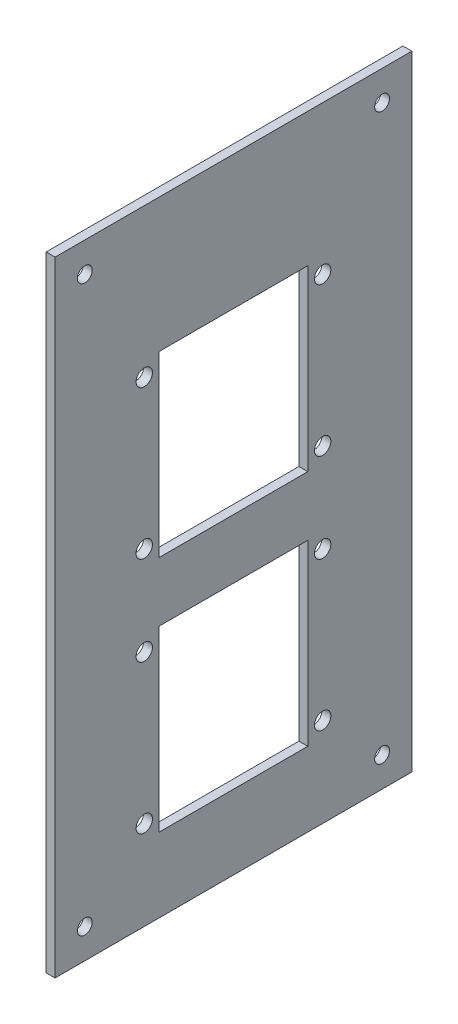
ISO-10303-21;
HEADER;
FILE_DESCRIPTION(('STEP AP214'),'2;1');
FILE_NAME('part.step','',(''),(''),'','','');
FILE_SCHEMA(('AUTOMOTIVE_DESIGN { 1 0 10303 214 1 1 1 1 }'));
ENDSEC;
DATA;
#1=APPLICATION_CONTEXT('core data for automotive mechanical design processes');
#2=APPLICATION_PROTOCOL_DEFINITION('international standard','automotive_design',2000,#1);
#3=PRODUCT_CONTEXT('',#1,'mechanical');
#4=PRODUCT('Part','Part','',(#3));
#5=PRODUCT_RELATED_PRODUCT_CATEGORY('part','',(#4));
#6=PRODUCT_DEFINITION_FORMATION('','',#4);
#7=PRODUCT_DEFINITION_CONTEXT('part definition',#1,'design');
#8=PRODUCT_DEFINITION('design','',#6,#7);
#9=PRODUCT_DEFINITION_SHAPE('','',#8);
#10=(LENGTH_UNIT() NAMED_UNIT(*) SI_UNIT(.MILLI.,.METRE.));
#11=(NAMED_UNIT(*) PLANE_ANGLE_UNIT() SI_UNIT($,.RADIAN.));
#12=(NAMED_UNIT(*) SI_UNIT($,.STERADIAN.) SOLID_ANGLE_UNIT());
#13=UNCERTAINTY_MEASURE_WITH_UNIT(LENGTH_MEASURE(1.E-05),#10,'distance_accuracy_value','');
#14=(GEOMETRIC_REPRESENTATION_CONTEXT(3) GLOBAL_UNCERTAINTY_ASSIGNED_CONTEXT((#13)) GLOBAL_UNIT_ASSIGNED_CONTEXT((#10,
#11,#12)) REPRESENTATION_CONTEXT('',''));
#15=CARTESIAN_POINT('',(0.,0.,0.));
#16=DIRECTION('',(0.,0.,1.));
#17=DIRECTION('',(1.,0.,0.));
#18=AXIS2_PLACEMENT_3D('',#15,#16,#17);
#19=CARTESIAN_POINT('',(-13.,0.,0.));
#20=DIRECTION('',(1.,0.,0.));
#21=DIRECTION('',(0.,0.,-1.));
#22=AXIS2_PLACEMENT_3D('',#19,#20,#21);
#23=PLANE('',#22);
#24=CARTESIAN_POINT('',(-13.0000000000002,40.,-80.0000000000008));
#25=DIRECTION('',(1.,0.,0.));
#26=DIRECTION('',(0.,0.,-1.));
#27=AXIS2_PLACEMENT_3D('',#24,#25,#26);
#28=CIRCLE('',#27,2.75000000000001);
#29=CARTESIAN_POINT('',(-13.0000000000002,40.,-82.7500000000008));
#30=VERTEX_POINT('',#29);
#31=EDGE_CURVE('E386',#30,#30,#28,.F.);
#32=ORIENTED_EDGE('',*,*,#31,.F.);
#33=EDGE_LOOP('',(#32));
#34=FACE_BOUND('',#33,.T.);
#35=CARTESIAN_POINT('',(-13.,40.,-20.0000000000008));
#36=DIRECTION('',(1.,0.,0.));
#37=DIRECTION('',(0.,0.,-1.));
#38=AXIS2_PLACEMENT_3D('',#35,#36,#37);
#39=CIRCLE('',#38,2.75);
#40=CARTESIAN_POINT('',(-13.,40.,-22.7500000000008));
#41=VERTEX_POINT('',#40);
#42=EDGE_CURVE('E403',#41,#41,#39,.F.);
#43=ORIENTED_EDGE('',*,*,#42,.F.);
#44=EDGE_LOOP('',(#43));
#45=FACE_BOUND('',#44,.T.);
#46=CARTESIAN_POINT('',(-13.,90.,-20.0000000000008));
#47=DIRECTION('',(1.,0.,0.));
#48=DIRECTION('',(0.,0.,-1.));
#49=AXIS2_PLACEMENT_3D('',#46,#47,#48);
#50=CIRCLE('',#49,2.75);
#51=CARTESIAN_POINT('',(-13.,90.,-22.7500000000008));
#52=VERTEX_POINT('',#51);
#53=EDGE_CURVE('E397',#52,#52,#50,.F.);
#54=ORIENTED_EDGE('',*,*,#53,.F.);
#55=EDGE_LOOP('',(#54));
#56=FACE_BOUND('',#55,.T.);
#57=CARTESIAN_POINT('',(-13.0000000000002,170.,-79.9999999999999));
#58=DIRECTION('',(1.,0.,0.));
#59=DIRECTION('',(0.,0.,-1.));
#60=AXIS2_PLACEMENT_3D('',#57,#58,#59);
#61=CIRCLE('',#60,2.75000000000001);
#62=CARTESIAN_POINT('',(-13.0000000000002,170.,-82.7499999999999));
#63=VERTEX_POINT('',#62);
#64=EDGE_CURVE('E389',#63,#63,#61,.F.);
#65=ORIENTED_EDGE('',*,*,#64,.F.);
#66=EDGE_LOOP('',(#65));
#67=FACE_BOUND('',#66,.T.);
#68=DIRECTION('',(0.,-1.,0.));
#69=VECTOR('',#68,1.);
#70=CARTESIAN_POINT('',(-13.0000000000002,35.,-75.0000000000008));
#71=LINE('',#70,#69);
#72=CARTESIAN_POINT('',(-13.0000000000002,95.,-75.0000000000008));
#73=VERTEX_POINT('',#72);
#74=CARTESIAN_POINT('',(-13.0000000000001,35.,-75.0000000000008));
#75=VERTEX_POINT('',#74);
#76=EDGE_CURVE('E134',#73,#75,#71,.T.);
#77=ORIENTED_EDGE('',*,*,#76,.F.);
#78=DIRECTION('',(0.,0.,-1.));
#79=VECTOR('',#78,1.);
#80=CARTESIAN_POINT('',(-13.,95.,-25.0000000000008));
#81=LINE('',#80,#79);
#82=CARTESIAN_POINT('',(-13.,95.,-25.0000000000008));
#83=VERTEX_POINT('',#82);
#84=EDGE_CURVE('E143',#83,#73,#81,.T.);
#85=ORIENTED_EDGE('',*,*,#84,.F.);
#86=DIRECTION('',(0.,1.,0.));
#87=VECTOR('',#86,1.);
#88=CARTESIAN_POINT('',(-13.,35.,-25.0000000000008));
#89=LINE('',#88,#87);
#90=CARTESIAN_POINT('',(-13.,35.,-25.0000000000008));
#91=VERTEX_POINT('',#90);
#92=EDGE_CURVE('E140',#91,#83,#89,.T.);
#93=ORIENTED_EDGE('',*,*,#92,.F.);
#94=DIRECTION('',(0.,0.,1.));
#95=VECTOR('',#94,1.);
#96=CARTESIAN_POINT('',(-13.,35.,-25.0000000000008));
#97=LINE('',#96,#95);
#98=EDGE_CURVE('E56',#75,#91,#97,.T.);
#99=ORIENTED_EDGE('',*,*,#98,.F.);
#100=EDGE_LOOP('',(#77,#85,#93,#99));
#101=FACE_BOUND('',#100,.T.);
#102=CARTESIAN_POINT('',(-13.,170.,-19.9999999999999));
#103=DIRECTION('',(1.,0.,0.));
#104=DIRECTION('',(0.,0.,-1.));
#105=AXIS2_PLACEMENT_3D('',#102,#103,#104);
#106=CIRCLE('',#105,2.75);
#107=CARTESIAN_POINT('',(-13.,170.,-22.7499999999999));
#108=VERTEX_POINT('',#107);
#109=EDGE_CURVE('E157',#108,#108,#106,.F.);
#110=ORIENTED_EDGE('',*,*,#109,.F.);
#111=EDGE_LOOP('',(#110));
#112=FACE_BOUND('',#111,.T.);
#113=CARTESIAN_POINT('',(-13.,120.,-19.9999999999999));
#114=DIRECTION('',(1.,0.,0.));
#115=DIRECTION('',(0.,0.,-1.));
#116=AXIS2_PLACEMENT_3D('',#113,#114,#115);
#117=CIRCLE('',#116,2.75);
#118=CARTESIAN_POINT('',(-13.,120.,-22.7499999999999));
#119=VERTEX_POINT('',#118);
#120=EDGE_CURVE('E413',#119,#119,#117,.F.);
#121=ORIENTED_EDGE('',*,*,#120,.F.);
#122=EDGE_LOOP('',(#121));
#123=FACE_BOUND('',#122,.T.);
#124=CARTESIAN_POINT('',(-13.0000000000002,120.,-79.9999999999999));
#125=DIRECTION('',(1.,0.,0.));
#126=DIRECTION('',(0.,0.,-1.));
#127=AXIS2_PLACEMENT_3D('',#124,#125,#126);
#128=CIRCLE('',#127,2.75000000000001);
#129=CARTESIAN_POINT('',(-13.0000000000002,120.,-82.7499999999999));
#130=VERTEX_POINT('',#129);
#131=EDGE_CURVE('E396',#130,#130,#128,.F.);
#132=ORIENTED_EDGE('',*,*,#131,.F.);
#133=EDGE_LOOP('',(#132));
#134=FACE_BOUND('',#133,.T.);
#135=CARTESIAN_POINT('',(-13.0000000000002,90.,-80.0000000000008));
#136=DIRECTION('',(1.,0.,0.));
#137=DIRECTION('',(0.,0.,-1.));
#138=AXIS2_PLACEMENT_3D('',#135,#136,#137);
#139=CIRCLE('',#138,2.75000000000001);
#140=CARTESIAN_POINT('',(-13.0000000000002,90.,-82.7500000000008));
#141=VERTEX_POINT('',#140);
#142=EDGE_CURVE('E383',#141,#141,#139,.F.);
#143=ORIENTED_EDGE('',*,*,#142,.F.);
#144=EDGE_LOOP('',(#143));
#145=FACE_BOUND('',#144,.T.);
#146=DIRECTION('',(0.,0.,1.));
#147=VECTOR('',#146,1.);
#148=CARTESIAN_POINT('',(-13.,115.,-24.9999999999999));
#149=LINE('',#148,#147);
#150=CARTESIAN_POINT('',(-13.0000000000001,115.,-74.9999999999999));
#151=VERTEX_POINT('',#150);
#152=CARTESIAN_POINT('',(-13.,115.,-24.9999999999999));
#153=VERTEX_POINT('',#152);
#154=EDGE_CURVE('E165',#151,#153,#149,.T.);
#155=ORIENTED_EDGE('',*,*,#154,.F.);
#156=DIRECTION('',(0.,-1.,0.));
#157=VECTOR('',#156,1.);
#158=CARTESIAN_POINT('',(-13.0000000000002,115.,-74.9999999999999));
#159=LINE('',#158,#157);
#160=CARTESIAN_POINT('',(-13.0000000000002,175.,-75.));
#161=VERTEX_POINT('',#160);
#162=EDGE_CURVE('E168',#161,#151,#159,.T.);
#163=ORIENTED_EDGE('',*,*,#162,.F.);
#164=DIRECTION('',(0.,0.,-1.));
#165=VECTOR('',#164,1.);
#166=CARTESIAN_POINT('',(-13.,175.,-24.9999999999999));
#167=LINE('',#166,#165);
#168=CARTESIAN_POINT('',(-13.,175.,-24.9999999999999));
#169=VERTEX_POINT('',#168);
#170=EDGE_CURVE('E185',#169,#161,#167,.T.);
#171=ORIENTED_EDGE('',*,*,#170,.F.);
#172=DIRECTION('',(0.,1.,0.));
#173=VECTOR('',#172,1.);
#174=CARTESIAN_POINT('',(-13.,115.,-24.9999999999999));
#175=LINE('',#174,#173);
#176=EDGE_CURVE('E64',#153,#169,#175,.T.);
#177=ORIENTED_EDGE('',*,*,#176,.F.);
#178=EDGE_LOOP('',(#155,#163,#171,#177));
#179=FACE_BOUND('',#178,.T.);
#180=DIRECTION('',(0.,1.,0.));
#181=VECTOR('',#180,1.);
#182=CARTESIAN_POINT('',(-12.9999999999999,220.,10.0000000000001));
#183=LINE('',#182,#181);
#184=CARTESIAN_POINT('',(-12.9999999999999,10.0000000000001,10.));
#185=VERTEX_POINT('',#184);
#186=CARTESIAN_POINT('',(-12.9999999999999,220.,10.0000000000001));
#187=VERTEX_POINT('',#186);
#188=EDGE_CURVE('E219',#185,#187,#183,.T.);
#189=ORIENTED_EDGE('',*,*,#188,.T.);
#190=DIRECTION('',(0.,0.,-1.));
#191=VECTOR('',#190,1.);
#192=CARTESIAN_POINT('',(-12.9999999999999,220.,10.0000000000001));
#193=LINE('',#192,#191);
#194=CARTESIAN_POINT('',(-13.0000000000003,220.,-110.));
#195=VERTEX_POINT('',#194);
#196=EDGE_CURVE('E222',#187,#195,#193,.T.);
#197=ORIENTED_EDGE('',*,*,#196,.T.);
#198=DIRECTION('',(0.,-1.,0.));
#199=VECTOR('',#198,1.);
#200=CARTESIAN_POINT('',(-13.0000000000003,220.,-110.));
#201=LINE('',#200,#199);
#202=CARTESIAN_POINT('',(-13.0000000000003,10.0000000000001,-110.));
#203=VERTEX_POINT('',#202);
#204=EDGE_CURVE('E225',#195,#203,#201,.T.);
#205=ORIENTED_EDGE('',*,*,#204,.T.);
#206=DIRECTION('',(0.,0.,1.));
#207=VECTOR('',#206,1.);
#208=CARTESIAN_POINT('',(-12.9999999999999,10.0000000000001,10.));
#209=LINE('',#208,#207);
#210=EDGE_CURVE('E227',#203,#185,#209,.T.);
#211=ORIENTED_EDGE('',*,*,#210,.T.);
#212=EDGE_LOOP('',(#189,#197,#205,#211));
#213=FACE_BOUND('',#212,.T.);
#214=CARTESIAN_POINT('',(-13.,210.,0.));
#215=DIRECTION('',(-1.,0.,0.));
#216=DIRECTION('',(0.,0.,1.));
#217=AXIS2_PLACEMENT_3D('',#214,#215,#216);
#218=CIRCLE('',#217,2.5);
#219=CARTESIAN_POINT('',(-13.,210.,2.50000000000005));
#220=VERTEX_POINT('',#219);
#221=EDGE_CURVE('E213',#220,#220,#218,.T.);
#222=ORIENTED_EDGE('',*,*,#221,.F.);
#223=EDGE_LOOP('',(#222));
#224=FACE_BOUND('',#223,.T.);
#225=CARTESIAN_POINT('',(-13.0000000000003,210.,-100.));
#226=DIRECTION('',(-1.,0.,0.));
#227=DIRECTION('',(0.,0.,-1.));
#228=AXIS2_PLACEMENT_3D('',#225,#226,#227);
#229=CIRCLE('',#228,2.5);
#230=CARTESIAN_POINT('',(-13.0000000000003,210.,-102.5));
#231=VERTEX_POINT('',#230);
#232=EDGE_CURVE('E207',#231,#231,#229,.T.);
#233=ORIENTED_EDGE('',*,*,#232,.F.);
#234=EDGE_LOOP('',(#233));
#235=FACE_BOUND('',#234,.T.);
#236=CARTESIAN_POINT('',(-13.0000000000003,20.0000000000001,-100.));
#237=DIRECTION('',(-1.,0.,0.));
#238=DIRECTION('',(0.,0.,1.));
#239=AXIS2_PLACEMENT_3D('',#236,#237,#238);
#240=CIRCLE('',#239,2.50000000000001);
#241=CARTESIAN_POINT('',(-13.0000000000003,20.0000000000001,-97.5));
#242=VERTEX_POINT('',#241);
#243=EDGE_CURVE('E201',#242,#242,#240,.T.);
#244=ORIENTED_EDGE('',*,*,#243,.F.);
#245=EDGE_LOOP('',(#244));
#246=FACE_BOUND('',#245,.T.);
#247=CARTESIAN_POINT('',(-13.,20.0000000000001,0.));
#248=DIRECTION('',(-1.,0.,0.));
#249=DIRECTION('',(0.,0.,-1.));
#250=AXIS2_PLACEMENT_3D('',#247,#248,#249);
#251=CIRCLE('',#250,2.5);
#252=CARTESIAN_POINT('',(-13.,20.0000000000001,-2.49999999999996));
#253=VERTEX_POINT('',#252);
#254=EDGE_CURVE('E195',#253,#253,#251,.T.);
#255=ORIENTED_EDGE('',*,*,#254,.F.);
#256=EDGE_LOOP('',(#255));
#257=FACE_BOUND('',#256,.T.);
#258=ADVANCED_FACE('F41',(#34,#45,#56,#67,#101,#112,#123,#134,#145,#179,#213,#224,#235,#246,
#257),#23,.F.);
#259=CARTESIAN_POINT('',(-9.99999999999997,0.,0.));
#260=DIRECTION('',(1.,0.,0.));
#261=DIRECTION('',(0.,0.,-1.));
#262=AXIS2_PLACEMENT_3D('',#259,#260,#261);
#263=PLANE('',#262);
#264=CARTESIAN_POINT('',(-10.0000000000002,40.,-80.0000000000008));
#265=DIRECTION('',(1.,0.,0.));
#266=DIRECTION('',(0.,0.,-1.));
#267=AXIS2_PLACEMENT_3D('',#264,#265,#266);
#268=CIRCLE('',#267,2.75000000000001);
#269=CARTESIAN_POINT('',(-10.0000000000002,40.,-82.7500000000008));
#270=VERTEX_POINT('',#269);
#271=EDGE_CURVE('E406',#270,#270,#268,.T.);
#272=ORIENTED_EDGE('',*,*,#271,.F.);
#273=EDGE_LOOP('',(#272));
#274=FACE_BOUND('',#273,.T.);
#275=CARTESIAN_POINT('',(-10.,40.,-20.0000000000008));
#276=DIRECTION('',(1.,0.,0.));
#277=DIRECTION('',(0.,0.,-1.));
#278=AXIS2_PLACEMENT_3D('',#275,#276,#277);
#279=CIRCLE('',#278,2.75);
#280=CARTESIAN_POINT('',(-10.,40.,-22.7500000000008));
#281=VERTEX_POINT('',#280);
#282=EDGE_CURVE('E400',#281,#281,#279,.T.);
#283=ORIENTED_EDGE('',*,*,#282,.F.);
#284=EDGE_LOOP('',(#283));
#285=FACE_BOUND('',#284,.T.);
#286=CARTESIAN_POINT('',(-10.,90.,-20.0000000000008));
#287=DIRECTION('',(1.,0.,0.));
#288=DIRECTION('',(0.,0.,-1.));
#289=AXIS2_PLACEMENT_3D('',#286,#287,#288);
#290=CIRCLE('',#289,2.75);
#291=CARTESIAN_POINT('',(-10.,90.,-22.7500000000008));
#292=VERTEX_POINT('',#291);
#293=EDGE_CURVE('E393',#292,#292,#290,.T.);
#294=ORIENTED_EDGE('',*,*,#293,.F.);
#295=EDGE_LOOP('',(#294));
#296=FACE_BOUND('',#295,.T.);
#297=CARTESIAN_POINT('',(-10.0000000000002,170.,-80.));
#298=DIRECTION('',(1.,0.,0.));
#299=DIRECTION('',(0.,0.,-1.));
#300=AXIS2_PLACEMENT_3D('',#297,#298,#299);
#301=CIRCLE('',#300,2.75000000000001);
#302=CARTESIAN_POINT('',(-10.0000000000002,170.,-82.75));
#303=VERTEX_POINT('',#302);
#304=EDGE_CURVE('E392',#303,#303,#301,.T.);
#305=ORIENTED_EDGE('',*,*,#304,.F.);
#306=EDGE_LOOP('',(#305));
#307=FACE_BOUND('',#306,.T.);
#308=DIRECTION('',(0.,0.,1.));
#309=VECTOR('',#308,1.);
#310=CARTESIAN_POINT('',(-10.,95.,-25.0000000000008));
#311=LINE('',#310,#309);
#312=CARTESIAN_POINT('',(-10.0000000000002,95.,-75.0000000000008));
#313=VERTEX_POINT('',#312);
#314=CARTESIAN_POINT('',(-10.,95.,-25.0000000000008));
#315=VERTEX_POINT('',#314);
#316=EDGE_CURVE('E150',#313,#315,#311,.T.);
#317=ORIENTED_EDGE('',*,*,#316,.F.);
#318=DIRECTION('',(0.,1.,0.));
#319=VECTOR('',#318,1.);
#320=CARTESIAN_POINT('',(-10.0000000000002,35.,-75.0000000000008));
#321=LINE('',#320,#319);
#322=CARTESIAN_POINT('',(-10.0000000000002,35.,-75.0000000000008));
#323=VERTEX_POINT('',#322);
#324=EDGE_CURVE('E136',#323,#313,#321,.T.);
#325=ORIENTED_EDGE('',*,*,#324,.F.);
#326=DIRECTION('',(0.,0.,-1.));
#327=VECTOR('',#326,1.);
#328=CARTESIAN_POINT('',(-10.,35.,-25.0000000000008));
#329=LINE('',#328,#327);
#330=CARTESIAN_POINT('',(-10.,35.,-25.0000000000008));
#331=VERTEX_POINT('',#330);
#332=EDGE_CURVE('E429',#331,#323,#329,.T.);
#333=ORIENTED_EDGE('',*,*,#332,.F.);
#334=DIRECTION('',(0.,-1.,0.));
#335=VECTOR('',#334,1.);
#336=CARTESIAN_POINT('',(-10.,35.,-25.0000000000008));
#337=LINE('',#336,#335);
#338=EDGE_CURVE('E432',#315,#331,#337,.T.);
#339=ORIENTED_EDGE('',*,*,#338,.F.);
#340=EDGE_LOOP('',(#317,#325,#333,#339));
#341=FACE_BOUND('',#340,.T.);
#342=CARTESIAN_POINT('',(-10.,170.,-19.9999999999999));
#343=DIRECTION('',(1.,0.,0.));
#344=DIRECTION('',(0.,0.,-1.));
#345=AXIS2_PLACEMENT_3D('',#342,#343,#344);
#346=CIRCLE('',#345,2.75);
#347=CARTESIAN_POINT('',(-10.,170.,-22.7499999999999));
#348=VERTEX_POINT('',#347);
#349=EDGE_CURVE('E160',#348,#348,#346,.T.);
#350=ORIENTED_EDGE('',*,*,#349,.F.);
#351=EDGE_LOOP('',(#350));
#352=FACE_BOUND('',#351,.T.);
#353=CARTESIAN_POINT('',(-10.,120.,-19.9999999999999));
#354=DIRECTION('',(1.,0.,0.));
#355=DIRECTION('',(0.,0.,-1.));
#356=AXIS2_PLACEMENT_3D('',#353,#354,#355);
#357=CIRCLE('',#356,2.75);
#358=CARTESIAN_POINT('',(-10.,120.,-22.7499999999999));
#359=VERTEX_POINT('',#358);
#360=EDGE_CURVE('E161',#359,#359,#357,.T.);
#361=ORIENTED_EDGE('',*,*,#360,.F.);
#362=EDGE_LOOP('',(#361));
#363=FACE_BOUND('',#362,.T.);
#364=CARTESIAN_POINT('',(-10.0000000000002,120.,-80.));
#365=DIRECTION('',(1.,0.,0.));
#366=DIRECTION('',(0.,0.,-1.));
#367=AXIS2_PLACEMENT_3D('',#364,#365,#366);
#368=CIRCLE('',#367,2.75000000000001);
#369=CARTESIAN_POINT('',(-10.0000000000002,120.,-82.75));
#370=VERTEX_POINT('',#369);
#371=EDGE_CURVE('E416',#370,#370,#368,.T.);
#372=ORIENTED_EDGE('',*,*,#371,.F.);
#373=EDGE_LOOP('',(#372));
#374=FACE_BOUND('',#373,.T.);
#375=CARTESIAN_POINT('',(-10.0000000000002,90.,-80.0000000000008));
#376=DIRECTION('',(1.,0.,0.));
#377=DIRECTION('',(0.,0.,-1.));
#378=AXIS2_PLACEMENT_3D('',#375,#376,#377);
#379=CIRCLE('',#378,2.75000000000001);
#380=CARTESIAN_POINT('',(-10.0000000000002,90.,-82.7500000000008));
#381=VERTEX_POINT('',#380);
#382=EDGE_CURVE('E380',#381,#381,#379,.T.);
#383=ORIENTED_EDGE('',*,*,#382,.F.);
#384=EDGE_LOOP('',(#383));
#385=FACE_BOUND('',#384,.T.);
#386=DIRECTION('',(0.,1.,0.));
#387=VECTOR('',#386,1.);
#388=CARTESIAN_POINT('',(-10.0000000000002,115.,-75.));
#389=LINE('',#388,#387);
#390=CARTESIAN_POINT('',(-10.0000000000002,115.,-75.));
#391=VERTEX_POINT('',#390);
#392=CARTESIAN_POINT('',(-10.0000000000002,175.,-75.));
#393=VERTEX_POINT('',#392);
#394=EDGE_CURVE('E171',#391,#393,#389,.T.);
#395=ORIENTED_EDGE('',*,*,#394,.F.);
#396=DIRECTION('',(0.,0.,-1.));
#397=VECTOR('',#396,1.);
#398=CARTESIAN_POINT('',(-10.,115.,-25.));
#399=LINE('',#398,#397);
#400=CARTESIAN_POINT('',(-10.,115.,-25.));
#401=VERTEX_POINT('',#400);
#402=EDGE_CURVE('E179',#401,#391,#399,.T.);
#403=ORIENTED_EDGE('',*,*,#402,.F.);
#404=DIRECTION('',(0.,-1.,0.));
#405=VECTOR('',#404,1.);
#406=CARTESIAN_POINT('',(-10.,115.,-25.));
#407=LINE('',#406,#405);
#408=CARTESIAN_POINT('',(-10.,175.,-25.));
#409=VERTEX_POINT('',#408);
#410=EDGE_CURVE('E176',#409,#401,#407,.T.);
#411=ORIENTED_EDGE('',*,*,#410,.F.);
#412=DIRECTION('',(0.,0.,1.));
#413=VECTOR('',#412,1.);
#414=CARTESIAN_POINT('',(-10.,175.,-25.));
#415=LINE('',#414,#413);
#416=EDGE_CURVE('E173',#393,#409,#415,.T.);
#417=ORIENTED_EDGE('',*,*,#416,.F.);
#418=EDGE_LOOP('',(#395,#403,#411,#417));
#419=FACE_BOUND('',#418,.T.);
#420=CARTESIAN_POINT('',(-10.0000000000003,20.0000000000001,-100.));
#421=DIRECTION('',(-1.,0.,0.));
#422=DIRECTION('',(0.,0.,1.));
#423=AXIS2_PLACEMENT_3D('',#420,#421,#422);
#424=CIRCLE('',#423,2.50000000000001);
#425=CARTESIAN_POINT('',(-10.0000000000003,20.0000000000001,-97.5));
#426=VERTEX_POINT('',#425);
#427=EDGE_CURVE('E198',#426,#426,#424,.T.);
#428=ORIENTED_EDGE('',*,*,#427,.T.);
#429=EDGE_LOOP('',(#428));
#430=FACE_BOUND('',#429,.T.);
#431=CARTESIAN_POINT('',(-9.99999999999997,210.,0.));
#432=DIRECTION('',(-1.,0.,0.));
#433=DIRECTION('',(0.,0.,1.));
#434=AXIS2_PLACEMENT_3D('',#431,#432,#433);
#435=CIRCLE('',#434,2.5);
#436=CARTESIAN_POINT('',(-9.99999999999997,210.,2.50000000000004));
#437=VERTEX_POINT('',#436);
#438=EDGE_CURVE('E210',#437,#437,#435,.T.);
#439=ORIENTED_EDGE('',*,*,#438,.T.);
#440=EDGE_LOOP('',(#439));
#441=FACE_BOUND('',#440,.T.);
#442=DIRECTION('',(0.,1.,0.));
#443=VECTOR('',#442,1.);
#444=CARTESIAN_POINT('',(-9.99999999999994,220.,10.0000000000001));
#445=LINE('',#444,#443);
#446=CARTESIAN_POINT('',(-9.99999999999994,10.0000000000001,10.));
#447=VERTEX_POINT('',#446);
#448=CARTESIAN_POINT('',(-9.99999999999994,220.,10.0000000000001));
#449=VERTEX_POINT('',#448);
#450=EDGE_CURVE('E216',#447,#449,#445,.T.);
#451=ORIENTED_EDGE('',*,*,#450,.F.);
#452=DIRECTION('',(0.,0.,1.));
#453=VECTOR('',#452,1.);
#454=CARTESIAN_POINT('',(-9.99999999999994,10.0000000000001,10.));
#455=LINE('',#454,#453);
#456=CARTESIAN_POINT('',(-10.0000000000003,10.0000000000001,-110.));
#457=VERTEX_POINT('',#456);
#458=EDGE_CURVE('E223',#457,#447,#455,.T.);
#459=ORIENTED_EDGE('',*,*,#458,.F.);
#460=DIRECTION('',(0.,-1.,0.));
#461=VECTOR('',#460,1.);
#462=CARTESIAN_POINT('',(-10.0000000000003,220.,-110.));
#463=LINE('',#462,#461);
#464=CARTESIAN_POINT('',(-10.0000000000003,220.,-110.));
#465=VERTEX_POINT('',#464);
#466=EDGE_CURVE('E234',#465,#457,#463,.T.);
#467=ORIENTED_EDGE('',*,*,#466,.F.);
#468=DIRECTION('',(0.,0.,-1.));
#469=VECTOR('',#468,1.);
#470=CARTESIAN_POINT('',(-9.99999999999994,220.,10.0000000000001));
#471=LINE('',#470,#469);
#472=EDGE_CURVE('E232',#449,#465,#471,.T.);
#473=ORIENTED_EDGE('',*,*,#472,.F.);
#474=EDGE_LOOP('',(#451,#459,#467,#473));
#475=FACE_BOUND('',#474,.T.);
#476=CARTESIAN_POINT('',(-10.0000000000003,210.,-100.));
#477=DIRECTION('',(-1.,0.,0.));
#478=DIRECTION('',(0.,0.,-1.));
#479=AXIS2_PLACEMENT_3D('',#476,#477,#478);
#480=CIRCLE('',#479,2.5);
#481=CARTESIAN_POINT('',(-10.0000000000003,210.,-102.5));
#482=VERTEX_POINT('',#481);
#483=EDGE_CURVE('E204',#482,#482,#480,.T.);
#484=ORIENTED_EDGE('',*,*,#483,.T.);
#485=EDGE_LOOP('',(#484));
#486=FACE_BOUND('',#485,.T.);
#487=CARTESIAN_POINT('',(-9.99999999999997,20.0000000000001,0.));
#488=DIRECTION('',(-1.,0.,0.));
#489=DIRECTION('',(0.,0.,-1.));
#490=AXIS2_PLACEMENT_3D('',#487,#488,#489);
#491=CIRCLE('',#490,2.5);
#492=CARTESIAN_POINT('',(-9.99999999999998,20.0000000000001,-2.49999999999997));
#493=VERTEX_POINT('',#492);
#494=EDGE_CURVE('E194',#493,#493,#491,.T.);
#495=ORIENTED_EDGE('',*,*,#494,.T.);
#496=EDGE_LOOP('',(#495));
#497=FACE_BOUND('',#496,.T.);
#498=ADVANCED_FACE('F252',(#274,#285,#296,#307,#341,#352,#363,#374,#385,#419,#430,#441,#475,
#486,#497),#263,.T.);
#499=CARTESIAN_POINT('',(-12.9999999999999,220.,10.0000000000001));
#500=DIRECTION('',(0.,0.,-1.));
#501=DIRECTION('',(-1.,0.,0.));
#502=AXIS2_PLACEMENT_3D('',#499,#500,#501);
#503=PLANE('',#502);
#504=ORIENTED_EDGE('',*,*,#450,.T.);
#505=DIRECTION('',(1.,0.,0.));
#506=VECTOR('',#505,1.);
#507=CARTESIAN_POINT('',(-12.9999999999999,220.,10.0000000000001));
#508=LINE('',#507,#506);
#509=EDGE_CURVE('E11',#187,#449,#508,.T.);
#510=ORIENTED_EDGE('',*,*,#509,.F.);
#511=ORIENTED_EDGE('',*,*,#188,.F.);
#512=DIRECTION('',(1.,0.,0.));
#513=VECTOR('',#512,1.);
#514=CARTESIAN_POINT('',(-12.9999999999999,10.0000000000001,10.));
#515=LINE('',#514,#513);
#516=EDGE_CURVE('E229',#185,#447,#515,.T.);
#517=ORIENTED_EDGE('',*,*,#516,.T.);
#518=EDGE_LOOP('',(#504,#510,#511,#517));
#519=FACE_BOUND('',#518,.T.);
#520=ADVANCED_FACE('F43',(#519),#503,.F.);
#521=CARTESIAN_POINT('',(-12.9999999999999,220.,10.0000000000001));
#522=DIRECTION('',(0.,-1.,0.));
#523=DIRECTION('',(0.,0.,-1.));
#524=AXIS2_PLACEMENT_3D('',#521,#522,#523);
#525=PLANE('',#524);
#526=ORIENTED_EDGE('',*,*,#472,.T.);
#527=DIRECTION('',(1.,0.,0.));
#528=VECTOR('',#527,1.);
#529=CARTESIAN_POINT('',(-13.0000000000003,220.,-110.));
#530=LINE('',#529,#528);
#531=EDGE_CURVE('E49',#195,#465,#530,.T.);
#532=ORIENTED_EDGE('',*,*,#531,.F.);
#533=ORIENTED_EDGE('',*,*,#196,.F.);
#534=ORIENTED_EDGE('',*,*,#509,.T.);
#535=EDGE_LOOP('',(#526,#532,#533,#534));
#536=FACE_BOUND('',#535,.T.);
#537=ADVANCED_FACE('F263',(#536),#525,.F.);
#538=CARTESIAN_POINT('',(-13.0000000000003,220.,-110.));
#539=DIRECTION('',(0.,0.,1.));
#540=DIRECTION('',(1.,0.,0.));
#541=AXIS2_PLACEMENT_3D('',#538,#539,#540);
#542=PLANE('',#541);
#543=ORIENTED_EDGE('',*,*,#466,.T.);
#544=DIRECTION('',(1.,0.,0.));
#545=VECTOR('',#544,1.);
#546=CARTESIAN_POINT('',(-13.0000000000003,10.0000000000001,-110.));
#547=LINE('',#546,#545);
#548=EDGE_CURVE('E239',#203,#457,#547,.T.);
#549=ORIENTED_EDGE('',*,*,#548,.F.);
#550=ORIENTED_EDGE('',*,*,#204,.F.);
#551=ORIENTED_EDGE('',*,*,#531,.T.);
#552=EDGE_LOOP('',(#543,#549,#550,#551));
#553=FACE_BOUND('',#552,.T.);
#554=ADVANCED_FACE('F246',(#553),#542,.F.);
#555=CARTESIAN_POINT('',(-12.9999999999999,10.0000000000001,10.));
#556=DIRECTION('',(0.,1.,0.));
#557=DIRECTION('',(-1.,0.,0.));
#558=AXIS2_PLACEMENT_3D('',#555,#556,#557);
#559=PLANE('',#558);
#560=ORIENTED_EDGE('',*,*,#458,.T.);
#561=ORIENTED_EDGE('',*,*,#516,.F.);
#562=ORIENTED_EDGE('',*,*,#210,.F.);
#563=ORIENTED_EDGE('',*,*,#548,.T.);
#564=EDGE_LOOP('',(#560,#561,#562,#563));
#565=FACE_BOUND('',#564,.T.);
#566=ADVANCED_FACE('F256',(#565),#559,.F.);
#567=CARTESIAN_POINT('',(-13.,210.,0.));
#568=DIRECTION('',(1.,0.,0.));
#569=DIRECTION('',(0.,0.,-1.));
#570=AXIS2_PLACEMENT_3D('',#567,#568,#569);
#571=CYLINDRICAL_SURFACE('',#570,2.5);
#572=ORIENTED_EDGE('',*,*,#221,.T.);
#573=EDGE_LOOP('',(#572));
#574=FACE_BOUND('',#573,.T.);
#575=ORIENTED_EDGE('',*,*,#438,.F.);
#576=EDGE_LOOP('',(#575));
#577=FACE_BOUND('',#576,.T.);
#578=ADVANCED_FACE('F282',(#574,#577),#571,.F.);
#579=CARTESIAN_POINT('',(-13.0000000000003,210.,-100.));
#580=DIRECTION('',(1.,0.,0.));
#581=DIRECTION('',(0.,0.,-1.));
#582=AXIS2_PLACEMENT_3D('',#579,#580,#581);
#583=CYLINDRICAL_SURFACE('',#582,2.5);
#584=ORIENTED_EDGE('',*,*,#232,.T.);
#585=EDGE_LOOP('',(#584));
#586=FACE_BOUND('',#585,.T.);
#587=ORIENTED_EDGE('',*,*,#483,.F.);
#588=EDGE_LOOP('',(#587));
#589=FACE_BOUND('',#588,.T.);
#590=ADVANCED_FACE('F289',(#586,#589),#583,.F.);
#591=CARTESIAN_POINT('',(-13.0000000000003,20.0000000000001,-100.));
#592=DIRECTION('',(1.,0.,0.));
#593=DIRECTION('',(0.,0.,-1.));
#594=AXIS2_PLACEMENT_3D('',#591,#592,#593);
#595=CYLINDRICAL_SURFACE('',#594,2.50000000000001);
#596=ORIENTED_EDGE('',*,*,#243,.T.);
#597=EDGE_LOOP('',(#596));
#598=FACE_BOUND('',#597,.T.);
#599=ORIENTED_EDGE('',*,*,#427,.F.);
#600=EDGE_LOOP('',(#599));
#601=FACE_BOUND('',#600,.T.);
#602=ADVANCED_FACE('F294',(#598,#601),#595,.F.);
#603=CARTESIAN_POINT('',(-13.,20.0000000000001,0.));
#604=DIRECTION('',(1.,0.,0.));
#605=DIRECTION('',(0.,0.,-1.));
#606=AXIS2_PLACEMENT_3D('',#603,#604,#605);
#607=CYLINDRICAL_SURFACE('',#606,2.5);
#608=ORIENTED_EDGE('',*,*,#254,.T.);
#609=EDGE_LOOP('',(#608));
#610=FACE_BOUND('',#609,.T.);
#611=ORIENTED_EDGE('',*,*,#494,.F.);
#612=EDGE_LOOP('',(#611));
#613=FACE_BOUND('',#612,.T.);
#614=ADVANCED_FACE('F307',(#610,#613),#607,.F.);
#615=CARTESIAN_POINT('',(-13.0010000000005,115.,-74.9999999999999));
#616=DIRECTION('',(0.,0.,-1.));
#617=DIRECTION('',(-1.,0.,0.));
#618=AXIS2_PLACEMENT_3D('',#615,#616,#617);
#619=PLANE('',#618);
#620=ORIENTED_EDGE('',*,*,#162,.T.);
#621=DIRECTION('',(1.,0.,0.));
#622=VECTOR('',#621,1.);
#623=CARTESIAN_POINT('',(-13.0010000000005,115.,-74.9999999999999));
#624=LINE('',#623,#622);
#625=EDGE_CURVE('E183',#151,#391,#624,.T.);
#626=ORIENTED_EDGE('',*,*,#625,.T.);
#627=ORIENTED_EDGE('',*,*,#394,.T.);
#628=DIRECTION('',(1.,0.,0.));
#629=VECTOR('',#628,1.);
#630=CARTESIAN_POINT('',(-13.0010000000005,175.,-74.9999999999999));
#631=LINE('',#630,#629);
#632=EDGE_CURVE('E182',#161,#393,#631,.T.);
#633=ORIENTED_EDGE('',*,*,#632,.F.);
#634=EDGE_LOOP('',(#620,#626,#627,#633));
#635=FACE_BOUND('',#634,.T.);
#636=ADVANCED_FACE('F309',(#635),#619,.F.);
#637=CARTESIAN_POINT('',(-13.0010000000004,115.,-24.9999999999999));
#638=DIRECTION('',(0.,-1.,0.));
#639=DIRECTION('',(0.,0.,-1.));
#640=AXIS2_PLACEMENT_3D('',#637,#638,#639);
#641=PLANE('',#640);
#642=ORIENTED_EDGE('',*,*,#154,.T.);
#643=DIRECTION('',(1.,0.,0.));
#644=VECTOR('',#643,1.);
#645=CARTESIAN_POINT('',(-13.0010000000004,115.,-24.9999999999999));
#646=LINE('',#645,#644);
#647=EDGE_CURVE('E186',#153,#401,#646,.T.);
#648=ORIENTED_EDGE('',*,*,#647,.T.);
#649=ORIENTED_EDGE('',*,*,#402,.T.);
#650=ORIENTED_EDGE('',*,*,#625,.F.);
#651=EDGE_LOOP('',(#642,#648,#649,#650));
#652=FACE_BOUND('',#651,.T.);
#653=ADVANCED_FACE('F317',(#652),#641,.F.);
#654=CARTESIAN_POINT('',(-13.0010000000004,115.,-24.9999999999999));
#655=DIRECTION('',(0.,0.,1.));
#656=DIRECTION('',(1.,0.,0.));
#657=AXIS2_PLACEMENT_3D('',#654,#655,#656);
#658=PLANE('',#657);
#659=ORIENTED_EDGE('',*,*,#176,.T.);
#660=DIRECTION('',(1.,0.,0.));
#661=VECTOR('',#660,1.);
#662=CARTESIAN_POINT('',(-13.0010000000004,175.,-24.9999999999999));
#663=LINE('',#662,#661);
#664=EDGE_CURVE('E188',#169,#409,#663,.T.);
#665=ORIENTED_EDGE('',*,*,#664,.T.);
#666=ORIENTED_EDGE('',*,*,#410,.T.);
#667=ORIENTED_EDGE('',*,*,#647,.F.);
#668=EDGE_LOOP('',(#659,#665,#666,#667));
#669=FACE_BOUND('',#668,.T.);
#670=ADVANCED_FACE('F327',(#669),#658,.F.);
#671=CARTESIAN_POINT('',(-13.0010000000004,175.,-24.9999999999999));
#672=DIRECTION('',(0.,1.,0.));
#673=DIRECTION('',(0.,0.,1.));
#674=AXIS2_PLACEMENT_3D('',#671,#672,#673);
#675=PLANE('',#674);
#676=ORIENTED_EDGE('',*,*,#170,.T.);
#677=ORIENTED_EDGE('',*,*,#632,.T.);
#678=ORIENTED_EDGE('',*,*,#416,.T.);
#679=ORIENTED_EDGE('',*,*,#664,.F.);
#680=EDGE_LOOP('',(#676,#677,#678,#679));
#681=FACE_BOUND('',#680,.T.);
#682=ADVANCED_FACE('F323',(#681),#675,.F.);
#683=CARTESIAN_POINT('',(-13.0010000000006,90.,-80.0000000000008));
#684=DIRECTION('',(1.,0.,0.));
#685=DIRECTION('',(0.,0.,-1.));
#686=AXIS2_PLACEMENT_3D('',#683,#684,#685);
#687=CYLINDRICAL_SURFACE('',#686,2.75000000000001);
#688=ORIENTED_EDGE('',*,*,#382,.T.);
#689=EDGE_LOOP('',(#688));
#690=FACE_BOUND('',#689,.T.);
#691=ORIENTED_EDGE('',*,*,#142,.T.);
#692=EDGE_LOOP('',(#691));
#693=FACE_BOUND('',#692,.T.);
#694=ADVANCED_FACE('F326',(#690,#693),#687,.F.);
#695=CARTESIAN_POINT('',(-13.0010000000006,120.,-79.9999999999999));
#696=DIRECTION('',(1.,0.,0.));
#697=DIRECTION('',(0.,0.,-1.));
#698=AXIS2_PLACEMENT_3D('',#695,#696,#697);
#699=CYLINDRICAL_SURFACE('',#698,2.75000000000001);
#700=ORIENTED_EDGE('',*,*,#371,.T.);
#701=EDGE_LOOP('',(#700));
#702=FACE_BOUND('',#701,.T.);
#703=ORIENTED_EDGE('',*,*,#131,.T.);
#704=EDGE_LOOP('',(#703));
#705=FACE_BOUND('',#704,.T.);
#706=ADVANCED_FACE('F351',(#702,#705),#699,.F.);
#707=CARTESIAN_POINT('',(-13.0010000000004,120.,-19.9999999999999));
#708=DIRECTION('',(1.,0.,0.));
#709=DIRECTION('',(0.,0.,-1.));
#710=AXIS2_PLACEMENT_3D('',#707,#708,#709);
#711=CYLINDRICAL_SURFACE('',#710,2.75);
#712=ORIENTED_EDGE('',*,*,#360,.T.);
#713=EDGE_LOOP('',(#712));
#714=FACE_BOUND('',#713,.T.);
#715=ORIENTED_EDGE('',*,*,#120,.T.);
#716=EDGE_LOOP('',(#715));
#717=FACE_BOUND('',#716,.T.);
#718=ADVANCED_FACE('F337',(#714,#717),#711,.F.);
#719=CARTESIAN_POINT('',(-13.0010000000004,170.,-19.9999999999999));
#720=DIRECTION('',(1.,0.,0.));
#721=DIRECTION('',(0.,0.,-1.));
#722=AXIS2_PLACEMENT_3D('',#719,#720,#721);
#723=CYLINDRICAL_SURFACE('',#722,2.75);
#724=ORIENTED_EDGE('',*,*,#349,.T.);
#725=EDGE_LOOP('',(#724));
#726=FACE_BOUND('',#725,.T.);
#727=ORIENTED_EDGE('',*,*,#109,.T.);
#728=EDGE_LOOP('',(#727));
#729=FACE_BOUND('',#728,.T.);
#730=ADVANCED_FACE('F334',(#726,#729),#723,.F.);
#731=CARTESIAN_POINT('',(-13.0010000000004,95.,-25.0000000000008));
#732=DIRECTION('',(0.,1.,0.));
#733=DIRECTION('',(0.,0.,1.));
#734=AXIS2_PLACEMENT_3D('',#731,#732,#733);
#735=PLANE('',#734);
#736=ORIENTED_EDGE('',*,*,#84,.T.);
#737=DIRECTION('',(1.,0.,0.));
#738=VECTOR('',#737,1.);
#739=CARTESIAN_POINT('',(-13.0010000000005,95.,-75.0000000000008));
#740=LINE('',#739,#738);
#741=EDGE_CURVE('E130',#73,#313,#740,.T.);
#742=ORIENTED_EDGE('',*,*,#741,.T.);
#743=ORIENTED_EDGE('',*,*,#316,.T.);
#744=DIRECTION('',(1.,0.,0.));
#745=VECTOR('',#744,1.);
#746=CARTESIAN_POINT('',(-13.0010000000004,95.,-25.0000000000008));
#747=LINE('',#746,#745);
#748=EDGE_CURVE('E146',#83,#315,#747,.T.);
#749=ORIENTED_EDGE('',*,*,#748,.F.);
#750=EDGE_LOOP('',(#736,#742,#743,#749));
#751=FACE_BOUND('',#750,.T.);
#752=ADVANCED_FACE('F144',(#751),#735,.F.);
#753=CARTESIAN_POINT('',(-13.0010000000005,35.,-75.0000000000008));
#754=DIRECTION('',(0.,0.,-1.));
#755=DIRECTION('',(-1.,0.,0.));
#756=AXIS2_PLACEMENT_3D('',#753,#754,#755);
#757=PLANE('',#756);
#758=ORIENTED_EDGE('',*,*,#76,.T.);
#759=DIRECTION('',(1.,0.,0.));
#760=VECTOR('',#759,1.);
#761=CARTESIAN_POINT('',(-13.0010000000005,35.,-75.0000000000008));
#762=LINE('',#761,#760);
#763=EDGE_CURVE('E139',#75,#323,#762,.T.);
#764=ORIENTED_EDGE('',*,*,#763,.T.);
#765=ORIENTED_EDGE('',*,*,#324,.T.);
#766=ORIENTED_EDGE('',*,*,#741,.F.);
#767=EDGE_LOOP('',(#758,#764,#765,#766));
#768=FACE_BOUND('',#767,.T.);
#769=ADVANCED_FACE('F132',(#768),#757,.F.);
#770=CARTESIAN_POINT('',(-13.0010000000004,35.,-25.0000000000008));
#771=DIRECTION('',(0.,-1.,0.));
#772=DIRECTION('',(0.,0.,-1.));
#773=AXIS2_PLACEMENT_3D('',#770,#771,#772);
#774=PLANE('',#773);
#775=ORIENTED_EDGE('',*,*,#98,.T.);
#776=DIRECTION('',(1.,0.,0.));
#777=VECTOR('',#776,1.);
#778=CARTESIAN_POINT('',(-13.0010000000004,35.,-25.0000000000008));
#779=LINE('',#778,#777);
#780=EDGE_CURVE('E425',#91,#331,#779,.T.);
#781=ORIENTED_EDGE('',*,*,#780,.T.);
#782=ORIENTED_EDGE('',*,*,#332,.T.);
#783=ORIENTED_EDGE('',*,*,#763,.F.);
#784=EDGE_LOOP('',(#775,#781,#782,#783));
#785=FACE_BOUND('',#784,.T.);
#786=ADVANCED_FACE('F341',(#785),#774,.F.);
#787=CARTESIAN_POINT('',(-13.0010000000004,35.,-25.0000000000008));
#788=DIRECTION('',(0.,0.,1.));
#789=DIRECTION('',(1.,0.,0.));
#790=AXIS2_PLACEMENT_3D('',#787,#788,#789);
#791=PLANE('',#790);
#792=ORIENTED_EDGE('',*,*,#92,.T.);
#793=ORIENTED_EDGE('',*,*,#748,.T.);
#794=ORIENTED_EDGE('',*,*,#338,.T.);
#795=ORIENTED_EDGE('',*,*,#780,.F.);
#796=EDGE_LOOP('',(#792,#793,#794,#795));
#797=FACE_BOUND('',#796,.T.);
#798=ADVANCED_FACE('F344',(#797),#791,.F.);
#799=CARTESIAN_POINT('',(-13.0010000000006,170.,-79.9999999999999));
#800=DIRECTION('',(1.,0.,0.));
#801=DIRECTION('',(0.,0.,-1.));
#802=AXIS2_PLACEMENT_3D('',#799,#800,#801);
#803=CYLINDRICAL_SURFACE('',#802,2.75000000000001);
#804=ORIENTED_EDGE('',*,*,#304,.T.);
#805=EDGE_LOOP('',(#804));
#806=FACE_BOUND('',#805,.T.);
#807=ORIENTED_EDGE('',*,*,#64,.T.);
#808=EDGE_LOOP('',(#807));
#809=FACE_BOUND('',#808,.T.);
#810=ADVANCED_FACE('F347',(#806,#809),#803,.F.);
#811=CARTESIAN_POINT('',(-13.0010000000004,90.,-20.0000000000008));
#812=DIRECTION('',(1.,0.,0.));
#813=DIRECTION('',(0.,0.,-1.));
#814=AXIS2_PLACEMENT_3D('',#811,#812,#813);
#815=CYLINDRICAL_SURFACE('',#814,2.75);
#816=ORIENTED_EDGE('',*,*,#293,.T.);
#817=EDGE_LOOP('',(#816));
#818=FACE_BOUND('',#817,.T.);
#819=ORIENTED_EDGE('',*,*,#53,.T.);
#820=EDGE_LOOP('',(#819));
#821=FACE_BOUND('',#820,.T.);
#822=ADVANCED_FACE('F365',(#818,#821),#815,.F.);
#823=CARTESIAN_POINT('',(-13.0010000000004,40.,-20.0000000000008));
#824=DIRECTION('',(1.,0.,0.));
#825=DIRECTION('',(0.,0.,-1.));
#826=AXIS2_PLACEMENT_3D('',#823,#824,#825);
#827=CYLINDRICAL_SURFACE('',#826,2.75);
#828=ORIENTED_EDGE('',*,*,#282,.T.);
#829=EDGE_LOOP('',(#828));
#830=FACE_BOUND('',#829,.T.);
#831=ORIENTED_EDGE('',*,*,#42,.T.);
#832=EDGE_LOOP('',(#831));
#833=FACE_BOUND('',#832,.T.);
#834=ADVANCED_FACE('F361',(#830,#833),#827,.F.);
#835=CARTESIAN_POINT('',(-13.0010000000006,40.,-80.0000000000008));
#836=DIRECTION('',(1.,0.,0.));
#837=DIRECTION('',(0.,0.,-1.));
#838=AXIS2_PLACEMENT_3D('',#835,#836,#837);
#839=CYLINDRICAL_SURFACE('',#838,2.75000000000001);
#840=ORIENTED_EDGE('',*,*,#271,.T.);
#841=EDGE_LOOP('',(#840));
#842=FACE_BOUND('',#841,.T.);
#843=ORIENTED_EDGE('',*,*,#31,.T.);
#844=EDGE_LOOP('',(#843));
#845=FACE_BOUND('',#844,.T.);
#846=ADVANCED_FACE('F358',(#842,#845),#839,.F.);
#847=CLOSED_SHELL('',(#258,#498,#520,#537,#554,#566,#578,#590,#602,#614,#636,#653,#670,#682,
#694,#706,#718,#730,#752,#769,#786,#798,#810,#822,#834,#846));
#848=MANIFOLD_SOLID_BREP('B2',#847);
#849=ADVANCED_BREP_SHAPE_REPRESENTATION('',(#18,#848),#14);
#850=SHAPE_DEFINITION_REPRESENTATION(#9,#849);
ENDSEC;
END-ISO-10303-21;
